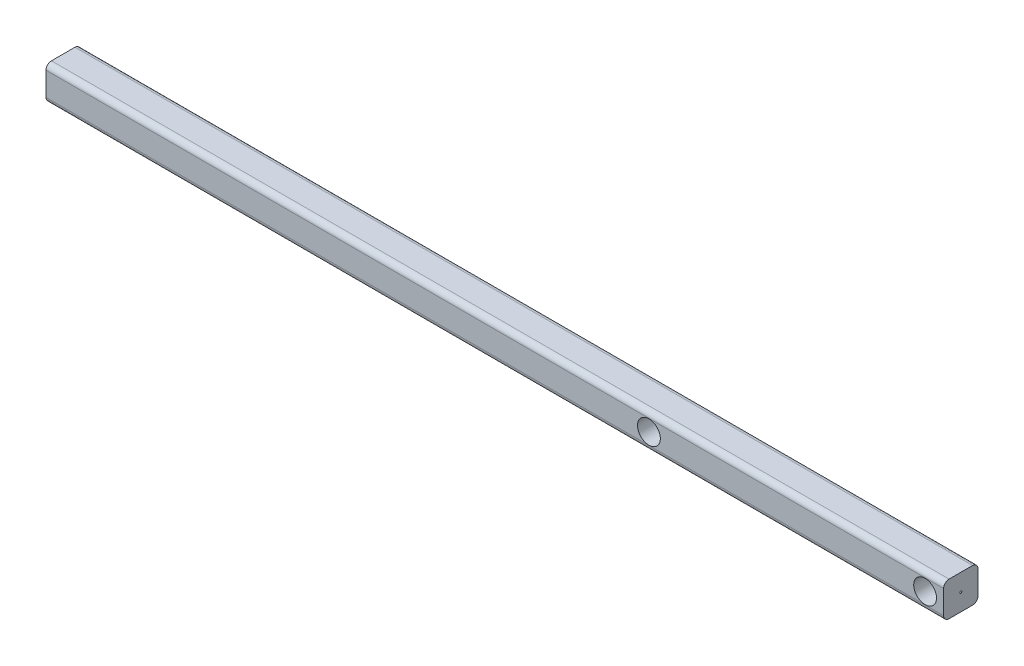
ISO-10303-21;
HEADER;
FILE_DESCRIPTION(('STEP AP214'),'2;1');
FILE_NAME('part.step','',(''),(''),'','','');
FILE_SCHEMA(('AUTOMOTIVE_DESIGN { 1 0 10303 214 1 1 1 1 }'));
ENDSEC;
DATA;
#1=APPLICATION_CONTEXT('core data for automotive mechanical design processes');
#2=APPLICATION_PROTOCOL_DEFINITION('international standard','automotive_design',2000,#1);
#3=PRODUCT_CONTEXT('',#1,'mechanical');
#4=PRODUCT('Part','Part','',(#3));
#5=PRODUCT_RELATED_PRODUCT_CATEGORY('part','',(#4));
#6=PRODUCT_DEFINITION_FORMATION('','',#4);
#7=PRODUCT_DEFINITION_CONTEXT('part definition',#1,'design');
#8=PRODUCT_DEFINITION('design','',#6,#7);
#9=PRODUCT_DEFINITION_SHAPE('','',#8);
#10=(LENGTH_UNIT() NAMED_UNIT(*) SI_UNIT(.MILLI.,.METRE.));
#11=(NAMED_UNIT(*) PLANE_ANGLE_UNIT() SI_UNIT($,.RADIAN.));
#12=(NAMED_UNIT(*) SI_UNIT($,.STERADIAN.) SOLID_ANGLE_UNIT());
#13=UNCERTAINTY_MEASURE_WITH_UNIT(LENGTH_MEASURE(1.E-05),#10,'distance_accuracy_value','');
#14=(GEOMETRIC_REPRESENTATION_CONTEXT(3) GLOBAL_UNCERTAINTY_ASSIGNED_CONTEXT((#13)) GLOBAL_UNIT_ASSIGNED_CONTEXT((#10,
#11,#12)) REPRESENTATION_CONTEXT('',''));
#15=CARTESIAN_POINT('',(0.,0.,0.));
#16=DIRECTION('',(0.,0.,1.));
#17=DIRECTION('',(1.,0.,0.));
#18=AXIS2_PLACEMENT_3D('',#15,#16,#17);
#19=CARTESIAN_POINT('',(165.1,0.,0.));
#20=DIRECTION('',(-1.,0.,0.));
#21=DIRECTION('',(0.,0.,1.));
#22=AXIS2_PLACEMENT_3D('',#19,#20,#21);
#23=CYLINDRICAL_SURFACE('',#22,0.186122299957088);
#24=CARTESIAN_POINT('',(163.791988099534,0.,0.186122299957089));
#25=CARTESIAN_POINT('',(163.792078316822,-0.010427907278757,0.186121846604635));
#26=CARTESIAN_POINT('',(163.792090307627,-0.0208635011874487,0.185242986726696));
#27=CARTESIAN_POINT('',(163.791963379452,-0.0414471761550977,0.181749413794973));
#28=CARTESIAN_POINT('',(163.791824292153,-0.0515949235815444,0.179132765900641));
#29=CARTESIAN_POINT('',(163.79141823497,-0.0713017636601238,0.172239467652708));
#30=CARTESIAN_POINT('',(163.791151336042,-0.0808611796119947,0.167963738606105));
#31=CARTESIAN_POINT('',(163.790526546924,-0.0991248984377559,0.157875261315146));
#32=CARTESIAN_POINT('',(163.790168675731,-0.10782937932225,0.152062833969416));
#33=CARTESIAN_POINT('',(163.789407370709,-0.124160448987272,0.139050137655764));
#34=CARTESIAN_POINT('',(163.789003836291,-0.131784571364698,0.131846779029851));
#35=CARTESIAN_POINT('',(163.788202677635,-0.145717596128625,0.116263255435251));
#36=CARTESIAN_POINT('',(163.787805053665,-0.152026438942248,0.10788303719189));
#37=CARTESIAN_POINT('',(163.787064350406,-0.163161103658044,0.0901645720709239));
#38=CARTESIAN_POINT('',(163.786721376432,-0.167984078466667,0.0808245311484106));
#39=CARTESIAN_POINT('',(163.786133315563,-0.175992628611122,0.0614641442734618));
#40=CARTESIAN_POINT('',(163.785888227153,-0.179178229305282,0.0514438088595989));
#41=CARTESIAN_POINT('',(163.785526535538,-0.183815481573218,0.0310280557570176));
#42=CARTESIAN_POINT('',(163.785409681062,-0.185270524591027,0.0206334129613672));
#43=CARTESIAN_POINT('',(163.785317966841,-0.186415751148911,-0.000253162914811269));
#44=CARTESIAN_POINT('',(163.78534310457,-0.186105966061032,-0.0107450942626025));
#45=CARTESIAN_POINT('',(163.785532046689,-0.183733491908787,-0.0315020133404447));
#46=CARTESIAN_POINT('',(163.785695519745,-0.181674991231673,-0.0417674832502983));
#47=CARTESIAN_POINT('',(163.786140687331,-0.175869991815682,-0.0618067764042813));
#48=CARTESIAN_POINT('',(163.786422383055,-0.172123476030103,-0.0715805946822767));
#49=CARTESIAN_POINT('',(163.787069903892,-0.16304398081363,-0.0903725411235635));
#50=CARTESIAN_POINT('',(163.787435829071,-0.157709112142676,-0.0993897528892511));
#51=CARTESIAN_POINT('',(163.788206586818,-0.145605550488633,-0.116402410078455));
#52=CARTESIAN_POINT('',(163.788611420125,-0.138836830237299,-0.124397836065542));
#53=CARTESIAN_POINT('',(163.789410811206,-0.124035027405267,-0.139163218445122));
#54=CARTESIAN_POINT('',(163.789805337206,-0.115998474491481,-0.145929698250767));
#55=CARTESIAN_POINT('',(163.790532656729,-0.0989011925875379,-0.158017953910922));
#56=CARTESIAN_POINT('',(163.790865450419,-0.089840466390876,-0.163339733705806));
#57=CARTESIAN_POINT('',(163.79142509431,-0.0709543634540301,-0.172384952423503));
#58=CARTESIAN_POINT('',(163.791651982615,-0.0611292632229046,-0.176108966184612));
#59=CARTESIAN_POINT('',(163.791967204661,-0.0409911059230146,-0.18185398213688));
#60=CARTESIAN_POINT('',(163.79205554158,-0.0306780600531185,-0.183875023393053));
#61=CARTESIAN_POINT('',(163.792076112842,-0.00989235228905667,-0.186152117398513));
#62=CARTESIAN_POINT('',(163.792008847146,0.000579691287245219,-0.186413812482342));
#63=CARTESIAN_POINT('',(163.791719202713,0.0214175057213008,-0.185180274511846));
#64=CARTESIAN_POINT('',(163.791496824998,0.0317832772798283,-0.183685053050422));
#65=CARTESIAN_POINT('',(163.79091466453,0.0521048604898493,-0.178983973191424));
#66=CARTESIAN_POINT('',(163.79055501092,0.0620610477358262,-0.175779721443092));
#67=CARTESIAN_POINT('',(163.789731252298,0.0812940434402515,-0.167753915919284));
#68=CARTESIAN_POINT('',(163.789267145034,0.0905708372393925,-0.162932327258965));
#69=CARTESIAN_POINT('',(163.788277888094,0.108214272106374,-0.151790604192473));
#70=CARTESIAN_POINT('',(163.787752547396,0.11657789835245,-0.145465712704639));
#71=CARTESIAN_POINT('',(163.786694773029,0.132126611557521,-0.131503796295649));
#72=CARTESIAN_POINT('',(163.786162339219,0.139311675042437,-0.123866745245695));
#73=CARTESIAN_POINT('',(163.785143496822,0.152319107628689,-0.107471815210021));
#74=CARTESIAN_POINT('',(163.784657217898,0.158137701711882,-0.0987109322716099));
#75=CARTESIAN_POINT('',(163.78378318587,0.16822063782102,-0.0803317341035736));
#76=CARTESIAN_POINT('',(163.78339543128,0.172485003280834,-0.0707134318044038));
#77=CARTESIAN_POINT('',(163.782760176302,0.179328955477798,-0.0509129677662558));
#78=CARTESIAN_POINT('',(163.782512385447,0.181912033091643,-0.0407320222738837));
#79=CARTESIAN_POINT('',(163.78218222554,0.185331938587018,-0.0200783997875875));
#80=CARTESIAN_POINT('',(163.782099852119,0.186168812596348,-0.00960573050725911));
#81=CARTESIAN_POINT('',(163.782109313745,0.18607198773557,0.0112881534619228));
#82=CARTESIAN_POINT('',(163.78220043491,0.185145544424771,0.0217094028680781));
#83=CARTESIAN_POINT('',(163.782545782771,0.181563547508014,0.0422474893258358));
#84=CARTESIAN_POINT('',(163.782800009586,0.178907992628697,0.0523643261532559));
#85=CARTESIAN_POINT('',(163.783444677571,0.171945106525453,0.0720066711867519));
#86=CARTESIAN_POINT('',(163.783835105529,0.167637935492626,0.0815322366364715));
#87=CARTESIAN_POINT('',(163.7847113479,0.15749499478265,0.0997261971420254));
#88=CARTESIAN_POINT('',(163.785197161425,0.151659239317405,0.108394600166233));
#89=CARTESIAN_POINT('',(163.786216068388,0.138597720270816,0.124665351970132));
#90=CARTESIAN_POINT('',(163.786749340644,0.131366568226484,0.132263363886256));
#91=CARTESIAN_POINT('',(163.78780704997,0.115730209279481,0.146141421831774));
#92=CARTESIAN_POINT('',(163.788331484839,0.107324714638328,0.152421143906024));
#93=CARTESIAN_POINT('',(163.789320063217,0.0895532700249857,0.163498311618437));
#94=CARTESIAN_POINT('',(163.789784036978,0.0801847426497464,0.168291633974797));
#95=CARTESIAN_POINT('',(163.790604020601,0.0607778511773022,0.176230629047925));
#96=CARTESIAN_POINT('',(163.79096015338,0.0507402657216815,0.179378180609724));
#97=CARTESIAN_POINT('',(163.791432072205,0.0338704108968983,0.183141364414061));
#98=CARTESIAN_POINT('',(163.791588351316,0.0271467435102715,0.184257666977998));
#99=CARTESIAN_POINT('',(163.791836906979,0.0136164766152724,0.185748281690757));
#100=CARTESIAN_POINT('',(163.791929183718,0.00680987735021416,0.186122596015974));
#101=CARTESIAN_POINT('',(163.791988099534,0.,0.186122299957089));
#102=B_SPLINE_CURVE_WITH_KNOTS('',3,(#24,#25,#26,#27,#28,#29,#30,#31,#32,#33,#34,#35,#36,#37,
#38,#39,#40,#41,#42,#43,#44,#45,#46,#47,#48,#49,#50,#51,#52,#53,#54,#55,#56,#57,#58,#59,#60,#61,
#62,#63,#64,#65,#66,#67,#68,#69,#70,#71,#72,#73,#74,#75,#76,#77,#78,#79,#80,#81,#82,#83,#84,#85,
#86,#87,#88,#89,#90,#91,#92,#93,#94,#95,#96,#97,#98,#99,#100,#101),.UNSPECIFIED.,.T.,.F.,(4,2,2,
2,2,2,2,2,2,2,2,2,2,2,2,2,2,2,2,2,2,2,2,2,2,2,2,2,2,2,2,2,2,2,2,2,2,2,4),(0.,0.0312600471332667,
0.0625549574560673,0.0938325141659515,0.125103544540697,0.156444852973824,0.187787580638714,
0.219189996312692,0.25059192563677,0.281932213389389,0.313271944030599,0.344536823140684,
0.375802017991442,0.407104550295471,0.438407677948296,0.469798025226804,0.501188286888261,
0.532567245589121,0.563945484458721,0.595223043124159,0.626500395407797,0.657748395730636,
0.688997070094665,0.720345976731277,0.751695507685387,0.783130652217978,0.8145653227678,
0.845934515177502,0.877302878926591,0.908542449578753,0.939782043236503,0.971018607716063,
1.00225488178622,1.03361428308806,1.06498138161828,1.09643472997495,1.1278520917223,
1.14826632304036,1.16868049447945),.UNSPECIFIED.);
#103=CARTESIAN_POINT('',(163.791988099534,0.,0.186122299957089));
#104=VERTEX_POINT('',#103);
#105=EDGE_CURVE('E41',#104,#104,#102,.T.);
#106=ORIENTED_EDGE('',*,*,#105,.F.);
#107=EDGE_LOOP('',(#106));
#108=FACE_BOUND('',#107,.T.);
#109=CARTESIAN_POINT('',(165.1,0.,0.));
#110=DIRECTION('',(1.,0.,0.));
#111=DIRECTION('',(0.,0.,-1.));
#112=AXIS2_PLACEMENT_3D('',#109,#110,#111);
#113=CIRCLE('',#112,0.186122299957088);
#114=CARTESIAN_POINT('',(165.1,0.,-0.186122299957088));
#115=VERTEX_POINT('',#114);
#116=EDGE_CURVE('E138',#115,#115,#113,.T.);
#117=ORIENTED_EDGE('',*,*,#116,.T.);
#118=EDGE_LOOP('',(#117));
#119=FACE_BOUND('',#118,.T.);
#120=ADVANCED_FACE('F37',(#108,#119),#23,.F.);
#121=CARTESIAN_POINT('',(165.1,0.,0.));
#122=DIRECTION('',(-1.,0.,0.));
#123=DIRECTION('',(0.,0.,1.));
#124=AXIS2_PLACEMENT_3D('',#121,#122,#123);
#125=PLANE('',#124);
#126=DIRECTION('',(0.,0.,-1.));
#127=VECTOR('',#126,1.);
#128=CARTESIAN_POINT('',(165.1,-3.16,3.16));
#129=LINE('',#128,#127);
#130=CARTESIAN_POINT('',(165.1,-3.16,2.16));
#131=VERTEX_POINT('',#130);
#132=CARTESIAN_POINT('',(165.1,-3.16,-2.16));
#133=VERTEX_POINT('',#132);
#134=EDGE_CURVE('E147',#131,#133,#129,.T.);
#135=ORIENTED_EDGE('',*,*,#134,.T.);
#136=CARTESIAN_POINT('',(165.1,-2.16,-2.16));
#137=DIRECTION('',(-1.,0.,0.));
#138=DIRECTION('',(0.,0.,1.));
#139=AXIS2_PLACEMENT_3D('',#136,#137,#138);
#140=CIRCLE('',#139,1.);
#141=CARTESIAN_POINT('',(165.1,-2.16,-3.16));
#142=VERTEX_POINT('',#141);
#143=EDGE_CURVE('E166',#133,#142,#140,.F.);
#144=ORIENTED_EDGE('',*,*,#143,.T.);
#145=DIRECTION('',(0.,1.,0.));
#146=VECTOR('',#145,1.);
#147=CARTESIAN_POINT('',(165.1,-3.16,-3.16));
#148=LINE('',#147,#146);
#149=CARTESIAN_POINT('',(165.1,2.16,-3.16));
#150=VERTEX_POINT('',#149);
#151=EDGE_CURVE('E130',#142,#150,#148,.T.);
#152=ORIENTED_EDGE('',*,*,#151,.T.);
#153=CARTESIAN_POINT('',(165.1,2.16,-2.16));
#154=DIRECTION('',(-1.,0.,0.));
#155=DIRECTION('',(0.,0.,1.));
#156=AXIS2_PLACEMENT_3D('',#153,#154,#155);
#157=CIRCLE('',#156,1.);
#158=CARTESIAN_POINT('',(165.1,3.16,-2.16));
#159=VERTEX_POINT('',#158);
#160=EDGE_CURVE('E161',#150,#159,#157,.F.);
#161=ORIENTED_EDGE('',*,*,#160,.T.);
#162=DIRECTION('',(0.,0.,1.));
#163=VECTOR('',#162,1.);
#164=CARTESIAN_POINT('',(165.1,3.16,3.16));
#165=LINE('',#164,#163);
#166=CARTESIAN_POINT('',(165.1,3.16,2.16));
#167=VERTEX_POINT('',#166);
#168=EDGE_CURVE('E224',#159,#167,#165,.T.);
#169=ORIENTED_EDGE('',*,*,#168,.T.);
#170=CARTESIAN_POINT('',(165.1,2.16,2.16));
#171=DIRECTION('',(-1.,0.,0.));
#172=DIRECTION('',(0.,0.,1.));
#173=AXIS2_PLACEMENT_3D('',#170,#171,#172);
#174=CIRCLE('',#173,1.);
#175=CARTESIAN_POINT('',(165.1,2.16,3.16));
#176=VERTEX_POINT('',#175);
#177=EDGE_CURVE('E66',#167,#176,#174,.F.);
#178=ORIENTED_EDGE('',*,*,#177,.T.);
#179=DIRECTION('',(0.,-1.,0.));
#180=VECTOR('',#179,1.);
#181=CARTESIAN_POINT('',(165.1,-3.16,3.16));
#182=LINE('',#181,#180);
#183=CARTESIAN_POINT('',(165.1,-2.16,3.16));
#184=VERTEX_POINT('',#183);
#185=EDGE_CURVE('E225',#176,#184,#182,.T.);
#186=ORIENTED_EDGE('',*,*,#185,.T.);
#187=CARTESIAN_POINT('',(165.1,-2.16,2.16));
#188=DIRECTION('',(-1.,0.,0.));
#189=DIRECTION('',(0.,0.,1.));
#190=AXIS2_PLACEMENT_3D('',#187,#188,#189);
#191=CIRCLE('',#190,1.);
#192=EDGE_CURVE('E164',#184,#131,#191,.F.);
#193=ORIENTED_EDGE('',*,*,#192,.T.);
#194=EDGE_LOOP('',(#135,#144,#152,#161,#169,#178,#186,#193));
#195=FACE_BOUND('',#194,.T.);
#196=ORIENTED_EDGE('',*,*,#116,.F.);
#197=EDGE_LOOP('',(#196));
#198=FACE_BOUND('',#197,.T.);
#199=ADVANCED_FACE('F229',(#195,#198),#125,.F.);
#200=CARTESIAN_POINT('',(0.,0.,0.));
#201=DIRECTION('',(-1.,0.,0.));
#202=DIRECTION('',(0.,0.,1.));
#203=AXIS2_PLACEMENT_3D('',#200,#201,#202);
#204=PLANE('',#203);
#205=DIRECTION('',(0.,1.,0.));
#206=VECTOR('',#205,1.);
#207=CARTESIAN_POINT('',(0.,-3.16,-3.16));
#208=LINE('',#207,#206);
#209=CARTESIAN_POINT('',(0.,-2.16,-3.16));
#210=VERTEX_POINT('',#209);
#211=CARTESIAN_POINT('',(0.,2.16,-3.16));
#212=VERTEX_POINT('',#211);
#213=EDGE_CURVE('E127',#210,#212,#208,.T.);
#214=ORIENTED_EDGE('',*,*,#213,.F.);
#215=CARTESIAN_POINT('',(0.,-2.16,-2.16));
#216=DIRECTION('',(-1.,0.,0.));
#217=DIRECTION('',(0.,0.,1.));
#218=AXIS2_PLACEMENT_3D('',#215,#216,#217);
#219=CIRCLE('',#218,1.);
#220=CARTESIAN_POINT('',(0.,-3.16,-2.16));
#221=VERTEX_POINT('',#220);
#222=EDGE_CURVE('E110',#210,#221,#219,.T.);
#223=ORIENTED_EDGE('',*,*,#222,.T.);
#224=DIRECTION('',(0.,0.,-1.));
#225=VECTOR('',#224,1.);
#226=CARTESIAN_POINT('',(0.,-3.16,3.16));
#227=LINE('',#226,#225);
#228=CARTESIAN_POINT('',(0.,-3.16,2.16));
#229=VERTEX_POINT('',#228);
#230=EDGE_CURVE('E151',#229,#221,#227,.T.);
#231=ORIENTED_EDGE('',*,*,#230,.F.);
#232=CARTESIAN_POINT('',(0.,-2.16,2.16));
#233=DIRECTION('',(-1.,0.,0.));
#234=DIRECTION('',(0.,0.,1.));
#235=AXIS2_PLACEMENT_3D('',#232,#233,#234);
#236=CIRCLE('',#235,1.);
#237=CARTESIAN_POINT('',(0.,-2.16,3.16));
#238=VERTEX_POINT('',#237);
#239=EDGE_CURVE('E121',#229,#238,#236,.T.);
#240=ORIENTED_EDGE('',*,*,#239,.T.);
#241=DIRECTION('',(0.,-1.,0.));
#242=VECTOR('',#241,1.);
#243=CARTESIAN_POINT('',(0.,-3.16,3.16));
#244=LINE('',#243,#242);
#245=CARTESIAN_POINT('',(0.,2.16,3.16));
#246=VERTEX_POINT('',#245);
#247=EDGE_CURVE('E141',#246,#238,#244,.T.);
#248=ORIENTED_EDGE('',*,*,#247,.F.);
#249=CARTESIAN_POINT('',(0.,2.16,2.16));
#250=DIRECTION('',(-1.,0.,0.));
#251=DIRECTION('',(0.,0.,1.));
#252=AXIS2_PLACEMENT_3D('',#249,#250,#251);
#253=CIRCLE('',#252,1.);
#254=CARTESIAN_POINT('',(0.,3.16,2.16));
#255=VERTEX_POINT('',#254);
#256=EDGE_CURVE('E155',#246,#255,#253,.T.);
#257=ORIENTED_EDGE('',*,*,#256,.T.);
#258=DIRECTION('',(0.,0.,1.));
#259=VECTOR('',#258,1.);
#260=CARTESIAN_POINT('',(0.,3.16,3.16));
#261=LINE('',#260,#259);
#262=CARTESIAN_POINT('',(0.,3.16,-2.16));
#263=VERTEX_POINT('',#262);
#264=EDGE_CURVE('E137',#263,#255,#261,.T.);
#265=ORIENTED_EDGE('',*,*,#264,.F.);
#266=CARTESIAN_POINT('',(0.,2.16,-2.16));
#267=DIRECTION('',(-1.,0.,0.));
#268=DIRECTION('',(0.,0.,1.));
#269=AXIS2_PLACEMENT_3D('',#266,#267,#268);
#270=CIRCLE('',#269,1.);
#271=EDGE_CURVE('E131',#263,#212,#270,.T.);
#272=ORIENTED_EDGE('',*,*,#271,.T.);
#273=EDGE_LOOP('',(#214,#223,#231,#240,#248,#257,#265,#272));
#274=FACE_BOUND('',#273,.T.);
#275=CARTESIAN_POINT('',(0.,0.,0.));
#276=DIRECTION('',(1.,0.,0.));
#277=DIRECTION('',(0.,0.,-1.));
#278=AXIS2_PLACEMENT_3D('',#275,#276,#277);
#279=CIRCLE('',#278,0.186122299957088);
#280=CARTESIAN_POINT('',(0.,0.,-0.186122299957088));
#281=VERTEX_POINT('',#280);
#282=EDGE_CURVE('E144',#281,#281,#279,.T.);
#283=ORIENTED_EDGE('',*,*,#282,.T.);
#284=EDGE_LOOP('',(#283));
#285=FACE_BOUND('',#284,.T.);
#286=ADVANCED_FACE('F134',(#274,#285),#204,.T.);
#287=CARTESIAN_POINT('',(165.1,-3.16,-3.16));
#288=DIRECTION('',(0.,0.,1.));
#289=DIRECTION('',(1.,0.,0.));
#290=AXIS2_PLACEMENT_3D('',#287,#288,#289);
#291=PLANE('',#290);
#292=CARTESIAN_POINT('',(161.692066873245,-0.0181891005987243,-3.16));
#293=DIRECTION('',(0.,0.,-1.));
#294=DIRECTION('',(-1.,0.,0.));
#295=AXIS2_PLACEMENT_3D('',#292,#293,#294);
#296=CIRCLE('',#295,2.09999999999999);
#297=CARTESIAN_POINT('',(159.592066873245,-0.0181891005987243,-3.16));
#298=VERTEX_POINT('',#297);
#299=EDGE_CURVE('E182',#298,#298,#296,.T.);
#300=ORIENTED_EDGE('',*,*,#299,.F.);
#301=EDGE_LOOP('',(#300));
#302=FACE_BOUND('',#301,.T.);
#303=CARTESIAN_POINT('',(110.892066873245,-0.0181891005987243,-3.16));
#304=DIRECTION('',(0.,0.,-1.));
#305=DIRECTION('',(-1.,0.,0.));
#306=AXIS2_PLACEMENT_3D('',#303,#304,#305);
#307=CIRCLE('',#306,2.09999999999999);
#308=CARTESIAN_POINT('',(108.792066873245,-0.0181891005987243,-3.16));
#309=VERTEX_POINT('',#308);
#310=EDGE_CURVE('E217',#309,#309,#307,.T.);
#311=ORIENTED_EDGE('',*,*,#310,.F.);
#312=EDGE_LOOP('',(#311));
#313=FACE_BOUND('',#312,.T.);
#314=ORIENTED_EDGE('',*,*,#151,.F.);
#315=DIRECTION('',(-1.,0.,0.));
#316=VECTOR('',#315,1.);
#317=CARTESIAN_POINT('',(165.1,-2.16,-3.16));
#318=LINE('',#317,#316);
#319=EDGE_CURVE('E114',#142,#210,#318,.T.);
#320=ORIENTED_EDGE('',*,*,#319,.T.);
#321=ORIENTED_EDGE('',*,*,#213,.T.);
#322=DIRECTION('',(-1.,0.,0.));
#323=VECTOR('',#322,1.);
#324=CARTESIAN_POINT('',(165.1,2.16,-3.16));
#325=LINE('',#324,#323);
#326=EDGE_CURVE('E132',#212,#150,#325,.F.);
#327=ORIENTED_EDGE('',*,*,#326,.T.);
#328=EDGE_LOOP('',(#314,#320,#321,#327));
#329=FACE_BOUND('',#328,.T.);
#330=ADVANCED_FACE('F126',(#302,#313,#329),#291,.F.);
#331=CARTESIAN_POINT('',(165.1,3.16,3.16));
#332=DIRECTION('',(0.,-1.,0.));
#333=DIRECTION('',(0.,0.,-1.));
#334=AXIS2_PLACEMENT_3D('',#331,#332,#333);
#335=PLANE('',#334);
#336=ORIENTED_EDGE('',*,*,#264,.T.);
#337=DIRECTION('',(-1.,0.,0.));
#338=VECTOR('',#337,1.);
#339=CARTESIAN_POINT('',(165.1,3.16,2.16));
#340=LINE('',#339,#338);
#341=EDGE_CURVE('E11',#255,#167,#340,.F.);
#342=ORIENTED_EDGE('',*,*,#341,.T.);
#343=ORIENTED_EDGE('',*,*,#168,.F.);
#344=DIRECTION('',(-1.,0.,0.));
#345=VECTOR('',#344,1.);
#346=CARTESIAN_POINT('',(165.1,3.16,-2.16));
#347=LINE('',#346,#345);
#348=EDGE_CURVE('E51',#159,#263,#347,.T.);
#349=ORIENTED_EDGE('',*,*,#348,.T.);
#350=EDGE_LOOP('',(#336,#342,#343,#349));
#351=FACE_BOUND('',#350,.T.);
#352=ADVANCED_FACE('F243',(#351),#335,.F.);
#353=CARTESIAN_POINT('',(165.1,-3.16,3.16));
#354=DIRECTION('',(0.,0.,-1.));
#355=DIRECTION('',(-1.,0.,0.));
#356=AXIS2_PLACEMENT_3D('',#353,#354,#355);
#357=PLANE('',#356);
#358=CARTESIAN_POINT('',(161.692066873245,-0.0181891005987243,3.16));
#359=DIRECTION('',(0.,0.,-1.));
#360=DIRECTION('',(-1.,0.,0.));
#361=AXIS2_PLACEMENT_3D('',#358,#359,#360);
#362=CIRCLE('',#361,2.09999999999999);
#363=CARTESIAN_POINT('',(159.592066873245,-0.0181891005987243,3.16));
#364=VERTEX_POINT('',#363);
#365=EDGE_CURVE('E209',#364,#364,#362,.T.);
#366=ORIENTED_EDGE('',*,*,#365,.T.);
#367=EDGE_LOOP('',(#366));
#368=FACE_BOUND('',#367,.T.);
#369=CARTESIAN_POINT('',(110.892066873245,-0.0181891005987243,3.16));
#370=DIRECTION('',(0.,0.,-1.));
#371=DIRECTION('',(-1.,0.,0.));
#372=AXIS2_PLACEMENT_3D('',#369,#370,#371);
#373=CIRCLE('',#372,2.09999999999999);
#374=CARTESIAN_POINT('',(108.792066873245,-0.0181891005987243,3.16));
#375=VERTEX_POINT('',#374);
#376=EDGE_CURVE('E205',#375,#375,#373,.T.);
#377=ORIENTED_EDGE('',*,*,#376,.T.);
#378=EDGE_LOOP('',(#377));
#379=FACE_BOUND('',#378,.T.);
#380=ORIENTED_EDGE('',*,*,#247,.T.);
#381=DIRECTION('',(-1.,0.,0.));
#382=VECTOR('',#381,1.);
#383=CARTESIAN_POINT('',(165.1,-2.16,3.16));
#384=LINE('',#383,#382);
#385=EDGE_CURVE('E59',#238,#184,#384,.F.);
#386=ORIENTED_EDGE('',*,*,#385,.T.);
#387=ORIENTED_EDGE('',*,*,#185,.F.);
#388=DIRECTION('',(-1.,0.,0.));
#389=VECTOR('',#388,1.);
#390=CARTESIAN_POINT('',(165.1,2.16,3.16));
#391=LINE('',#390,#389);
#392=EDGE_CURVE('E168',#176,#246,#391,.T.);
#393=ORIENTED_EDGE('',*,*,#392,.T.);
#394=EDGE_LOOP('',(#380,#386,#387,#393));
#395=FACE_BOUND('',#394,.T.);
#396=ADVANCED_FACE('F237',(#368,#379,#395),#357,.F.);
#397=CARTESIAN_POINT('',(165.1,-3.16,3.16));
#398=DIRECTION('',(0.,1.,0.));
#399=DIRECTION('',(0.,0.,1.));
#400=AXIS2_PLACEMENT_3D('',#397,#398,#399);
#401=PLANE('',#400);
#402=ORIENTED_EDGE('',*,*,#230,.T.);
#403=DIRECTION('',(-1.,0.,0.));
#404=VECTOR('',#403,1.);
#405=CARTESIAN_POINT('',(165.1,-3.16,-2.16));
#406=LINE('',#405,#404);
#407=EDGE_CURVE('E115',#221,#133,#406,.F.);
#408=ORIENTED_EDGE('',*,*,#407,.T.);
#409=ORIENTED_EDGE('',*,*,#134,.F.);
#410=DIRECTION('',(-1.,0.,0.));
#411=VECTOR('',#410,1.);
#412=CARTESIAN_POINT('',(165.1,-3.16,2.16));
#413=LINE('',#412,#411);
#414=EDGE_CURVE('E120',#131,#229,#413,.T.);
#415=ORIENTED_EDGE('',*,*,#414,.T.);
#416=EDGE_LOOP('',(#402,#408,#409,#415));
#417=FACE_BOUND('',#416,.T.);
#418=ADVANCED_FACE('F233',(#417),#401,.F.);
#419=CARTESIAN_POINT('',(108.792145646956,0.,0.186122299957089));
#420=CARTESIAN_POINT('',(108.792236165869,0.010437889701856,0.186121844257441));
#421=CARTESIAN_POINT('',(108.792405183893,0.0208821738784626,0.185241293977184));
#422=CARTESIAN_POINT('',(108.7928894019,0.0414802107503931,0.181742323572651));
#423=CARTESIAN_POINT('',(108.793204767328,0.0516336207827093,0.179121935110181));
#424=CARTESIAN_POINT('',(108.793953374306,0.0713486883580442,0.172220339452475));
#425=CARTESIAN_POINT('',(108.794386545327,0.0809106957760162,0.167940125324291));
#426=CARTESIAN_POINT('',(108.79532922708,0.0991778640645701,0.157842244941071));
#427=CARTESIAN_POINT('',(108.79583872176,0.107883204475823,0.152024901784103));
#428=CARTESIAN_POINT('',(108.796885004696,0.124219590173705,0.138998010882917));
#429=CARTESIAN_POINT('',(108.79742186543,0.131847556897266,0.131784607805289));
#430=CARTESIAN_POINT('',(108.798466823829,0.145785930713842,0.116178471548368));
#431=CARTESIAN_POINT('',(108.798974920239,0.152096280380489,0.107785686994158));
#432=CARTESIAN_POINT('',(108.799910258745,0.163227705726657,0.0900446093024885));
#433=CARTESIAN_POINT('',(108.8003373921,0.168046783919542,0.0806950567211975));
#434=CARTESIAN_POINT('',(108.80106490332,0.176045261230212,0.0613144733471929));
#435=CARTESIAN_POINT('',(108.801365284286,0.179224700477291,0.0512834592396901));
#436=CARTESIAN_POINT('',(108.801806520071,0.183843262539249,0.0308609116182943));
#437=CARTESIAN_POINT('',(108.801947913297,0.185288260122488,0.0204707184437703));
#438=CARTESIAN_POINT('',(108.802057917795,0.186415161792608,-0.000405616846314139));
#439=CARTESIAN_POINT('',(108.802026533295,0.18609710902417,-0.0108917566076378));
#440=CARTESIAN_POINT('',(108.801794740121,0.183711380499417,-0.0316255859256081));
#441=CARTESIAN_POINT('',(108.801594893741,0.181649525153479,-0.0418739523403421));
#442=CARTESIAN_POINT('',(108.801048064426,0.175843810228726,-0.0618784323197827));
#443=CARTESIAN_POINT('',(108.80070107977,0.172099930967012,-0.0716345401226354));
#444=CARTESIAN_POINT('',(108.799895691831,0.163030117340232,-0.0903959915270514));
#445=CARTESIAN_POINT('',(108.799437106551,0.157701595571824,-0.0994000761879287));
#446=CARTESIAN_POINT('',(108.798456454787,0.145615820369686,-0.11638821671088));
#447=CARTESIAN_POINT('',(108.797934386583,0.138858528213557,-0.124372244918072));
#448=CARTESIAN_POINT('',(108.796878012245,0.124073554216898,-0.139128730541697));
#449=CARTESIAN_POINT('',(108.796343664027,0.116040672290095,-0.145895975747462));
#450=CARTESIAN_POINT('',(108.795319055235,0.0989507466047946,-0.15798678448555));
#451=CARTESIAN_POINT('',(108.794828794869,0.0898936980268459,-0.163310341223863));
#452=CARTESIAN_POINT('',(108.793940569101,0.0710037905465831,-0.17236515740739));
#453=CARTESIAN_POINT('',(108.793542666933,0.0611704062656391,-0.176095327405952));
#454=CARTESIAN_POINT('',(108.792877314272,0.0410123710083407,-0.181849811119691));
#455=CARTESIAN_POINT('',(108.792609860694,0.0306877316582143,-0.183874165184158));
#456=CARTESIAN_POINT('',(108.792228764052,0.00987873544195974,-0.186153408445671));
#457=CARTESIAN_POINT('',(108.792114586631,-0.000604937008753058,-0.186414457853213));
#458=CARTESIAN_POINT('',(108.79204352161,-0.0214680861899529,-0.185175132706346));
#459=CARTESIAN_POINT('',(108.792086631743,-0.0318475644197559,-0.183674783534552));
#460=CARTESIAN_POINT('',(108.792317453158,-0.0521832317439134,-0.178961215789191));
#461=CARTESIAN_POINT('',(108.792504835495,-0.0621403294634929,-0.175751898844721));
#462=CARTESIAN_POINT('',(108.792995611198,-0.0813752315194363,-0.167714731151745));
#463=CARTESIAN_POINT('',(108.793299006184,-0.0906530263712433,-0.162886857809894));
#464=CARTESIAN_POINT('',(108.79398191923,-0.108287160047642,-0.151738069461346));
#465=CARTESIAN_POINT('',(108.794361593392,-0.11664155393302,-0.14541408796647));
#466=CARTESIAN_POINT('',(108.795148096385,-0.132172573873516,-0.131456950550184));
#467=CARTESIAN_POINT('',(108.795554925735,-0.139349177403594,-0.123823769596263));
#468=CARTESIAN_POINT('',(108.796346062521,-0.152341580956164,-0.107439164116747));
#469=CARTESIAN_POINT('',(108.796730302787,-0.158153462526887,-0.0986846285006575));
#470=CARTESIAN_POINT('',(108.797427325208,-0.168224956870835,-0.0803214314994157));
#471=CARTESIAN_POINT('',(108.797740107904,-0.172484581392607,-0.0707127765795083));
#472=CARTESIAN_POINT('',(108.798255385965,-0.179326618718904,-0.0509216006205995));
#473=CARTESIAN_POINT('',(108.798457970428,-0.181910386830977,-0.0407395505624046));
#474=CARTESIAN_POINT('',(108.79872828052,-0.185331335723129,-0.0200844527661894));
#475=CARTESIAN_POINT('',(108.798796008569,-0.186168547847558,-0.00961141025384754));
#476=CARTESIAN_POINT('',(108.798788284821,-0.186072239496471,0.011296427042157));
#477=CARTESIAN_POINT('',(108.798713241523,-0.185143771029434,0.0217312456156276));
#478=CARTESIAN_POINT('',(108.798429981627,-0.181553000062445,0.0422962503221566));
#479=CARTESIAN_POINT('',(108.798221764756,-0.178890694028351,0.0524264358342266));
#480=CARTESIAN_POINT('',(108.797697675739,-0.171909082559467,0.0720948832689571));
#481=CARTESIAN_POINT('',(108.797381810335,-0.16758988087596,0.0816331822108578));
#482=CARTESIAN_POINT('',(108.796681152113,-0.157417537288518,0.0998502062942657));
#483=CARTESIAN_POINT('',(108.796296360391,-0.151564419749018,0.10852894508585));
#484=CARTESIAN_POINT('',(108.795504158667,-0.138471246985164,0.124806339475656));
#485=CARTESIAN_POINT('',(108.795096689744,-0.131227446355409,0.132401979528085));
#486=CARTESIAN_POINT('',(108.79431110468,-0.115565077064156,0.146272548457025));
#487=CARTESIAN_POINT('',(108.793932995528,-0.107146230022046,0.152547163482891));
#488=CARTESIAN_POINT('',(108.793254382436,-0.0893606060813994,0.163603284688622));
#489=CARTESIAN_POINT('',(108.792953990295,-0.0799924902744073,0.168382641935926));
#490=CARTESIAN_POINT('',(108.792472651689,-0.060590564369522,0.176294667045177));
#491=CARTESIAN_POINT('',(108.792291568399,-0.0505575314008554,0.179429220354779));
#492=CARTESIAN_POINT('',(108.792113827943,-0.0337214293131982,0.183167782421973));
#493=CARTESIAN_POINT('',(108.792074666342,-0.0270261236387088,0.184274291780998));
#494=CARTESIAN_POINT('',(108.79206118285,-0.0135547774629194,0.18575169734821));
#495=CARTESIAN_POINT('',(108.792086860751,-0.0067787372194155,0.186122595904665));
#496=CARTESIAN_POINT('',(108.792145646956,0.,0.186122299957089));
#497=B_SPLINE_CURVE_WITH_KNOTS('',3,(#419,#420,#421,#422,#423,#424,#425,#426,#427,#428,#429,
#430,#431,#432,#433,#434,#435,#436,#437,#438,#439,#440,#441,#442,#443,#444,#445,#446,#447,#448,
#449,#450,#451,#452,#453,#454,#455,#456,#457,#458,#459,#460,#461,#462,#463,#464,#465,#466,#467,
#468,#469,#470,#471,#472,#473,#474,#475,#476,#477,#478,#479,#480,#481,#482,#483,#484,#485,#486,
#487,#488,#489,#490,#491,#492,#493,#494,#495,#496),.UNSPECIFIED.,.T.,.F.,(4,2,2,2,2,2,2,2,2,2,2,
2,2,2,2,2,2,2,2,2,2,2,2,2,2,2,2,2,2,2,2,2,2,2,2,2,2,2,4),(0.,0.031290075833718,
0.0626156116514125,0.0939224343704268,0.125222681754349,0.156610633566484,0.187999953090111,
0.219431136910742,0.250861551433281,0.28218520409905,0.31350809022801,0.34472683853088,
0.37594595216237,0.407216322864513,0.438487541161912,0.469889677276436,0.501291961167101,
0.532715681514116,0.564138658545054,0.595451800486274,0.626764491195327,0.658005998592651,
0.689247942106737,0.720554483886229,0.751861624328298,0.783257585156762,0.814653308354136,
0.846023609271118,0.877393347200011,0.908673464289783,0.939953645139124,0.971231867609698,
1.00250959329291,1.03387276922142,1.06524338806172,1.09665888673319,1.1280382945422,
1.14835924875975,1.1686801381072),.UNSPECIFIED.);
#498=CARTESIAN_POINT('',(108.792145646956,0.,0.186122299957089));
#499=VERTEX_POINT('',#498);
#500=EDGE_CURVE('E174',#499,#499,#497,.T.);
#501=ORIENTED_EDGE('',*,*,#500,.F.);
#502=EDGE_LOOP('',(#501));
#503=FACE_BOUND('',#502,.T.);
#504=ORIENTED_EDGE('',*,*,#282,.F.);
#505=EDGE_LOOP('',(#504));
#506=FACE_BOUND('',#505,.T.);
#507=ADVANCED_FACE('F186',(#503,#506),#23,.F.);
#508=CARTESIAN_POINT('',(165.1,-2.16,-2.16));
#509=DIRECTION('',(-1.,0.,0.));
#510=DIRECTION('',(0.,0.,1.));
#511=AXIS2_PLACEMENT_3D('',#508,#509,#510);
#512=CYLINDRICAL_SURFACE('',#511,1.);
#513=ORIENTED_EDGE('',*,*,#143,.F.);
#514=ORIENTED_EDGE('',*,*,#407,.F.);
#515=ORIENTED_EDGE('',*,*,#222,.F.);
#516=ORIENTED_EDGE('',*,*,#319,.F.);
#517=EDGE_LOOP('',(#513,#514,#515,#516));
#518=FACE_BOUND('',#517,.T.);
#519=ADVANCED_FACE('F113',(#518),#512,.T.);
#520=CARTESIAN_POINT('',(165.1,-2.16,2.16));
#521=DIRECTION('',(-1.,0.,0.));
#522=DIRECTION('',(0.,0.,1.));
#523=AXIS2_PLACEMENT_3D('',#520,#521,#522);
#524=CYLINDRICAL_SURFACE('',#523,1.);
#525=ORIENTED_EDGE('',*,*,#192,.F.);
#526=ORIENTED_EDGE('',*,*,#385,.F.);
#527=ORIENTED_EDGE('',*,*,#239,.F.);
#528=ORIENTED_EDGE('',*,*,#414,.F.);
#529=EDGE_LOOP('',(#525,#526,#527,#528));
#530=FACE_BOUND('',#529,.T.);
#531=ADVANCED_FACE('F235',(#530),#524,.T.);
#532=CARTESIAN_POINT('',(165.1,2.16,2.16));
#533=DIRECTION('',(-1.,0.,0.));
#534=DIRECTION('',(0.,0.,1.));
#535=AXIS2_PLACEMENT_3D('',#532,#533,#534);
#536=CYLINDRICAL_SURFACE('',#535,1.);
#537=ORIENTED_EDGE('',*,*,#177,.F.);
#538=ORIENTED_EDGE('',*,*,#341,.F.);
#539=ORIENTED_EDGE('',*,*,#256,.F.);
#540=ORIENTED_EDGE('',*,*,#392,.F.);
#541=EDGE_LOOP('',(#537,#538,#539,#540));
#542=FACE_BOUND('',#541,.T.);
#543=ADVANCED_FACE('F240',(#542),#536,.T.);
#544=CARTESIAN_POINT('',(165.1,2.16,-2.16));
#545=DIRECTION('',(-1.,0.,0.));
#546=DIRECTION('',(0.,0.,1.));
#547=AXIS2_PLACEMENT_3D('',#544,#545,#546);
#548=CYLINDRICAL_SURFACE('',#547,1.);
#549=ORIENTED_EDGE('',*,*,#160,.F.);
#550=ORIENTED_EDGE('',*,*,#326,.F.);
#551=ORIENTED_EDGE('',*,*,#271,.F.);
#552=ORIENTED_EDGE('',*,*,#348,.F.);
#553=EDGE_LOOP('',(#549,#550,#551,#552));
#554=FACE_BOUND('',#553,.T.);
#555=ADVANCED_FACE('F39',(#554),#548,.T.);
#556=CARTESIAN_POINT('',(110.892066873245,-0.0181891005987243,161.94));
#557=DIRECTION('',(0.,0.,-1.));
#558=DIRECTION('',(-1.,0.,0.));
#559=AXIS2_PLACEMENT_3D('',#556,#557,#558);
#560=CYLINDRICAL_SURFACE('',#559,2.09999999999999);
#561=ORIENTED_EDGE('',*,*,#310,.T.);
#562=EDGE_LOOP('',(#561));
#563=FACE_BOUND('',#562,.T.);
#564=ORIENTED_EDGE('',*,*,#500,.T.);
#565=EDGE_LOOP('',(#564));
#566=FACE_BOUND('',#565,.T.);
#567=CARTESIAN_POINT('',(112.991988099534,0.,0.186122299957089));
#568=CARTESIAN_POINT('',(112.992078316822,-0.0104279072787572,0.186121846604636));
#569=CARTESIAN_POINT('',(112.992090307627,-0.020863501187449,0.185242986726696));
#570=CARTESIAN_POINT('',(112.991963379452,-0.041447176155098,0.181749413794973));
#571=CARTESIAN_POINT('',(112.991824292153,-0.0515949235815445,0.179132765900641));
#572=CARTESIAN_POINT('',(112.99141823497,-0.0713017636601239,0.172239467652708));
#573=CARTESIAN_POINT('',(112.991151336042,-0.0808611796119948,0.167963738606105));
#574=CARTESIAN_POINT('',(112.990526546924,-0.0991248984377562,0.157875261315145));
#575=CARTESIAN_POINT('',(112.990168675731,-0.10782937932225,0.152062833969416));
#576=CARTESIAN_POINT('',(112.989407370709,-0.124160448987272,0.139050137655763));
#577=CARTESIAN_POINT('',(112.989003836291,-0.131784571364698,0.131846779029851));
#578=CARTESIAN_POINT('',(112.988202677635,-0.145717596128625,0.116263255435251));
#579=CARTESIAN_POINT('',(112.987805053665,-0.152026438942248,0.107883037191889));
#580=CARTESIAN_POINT('',(112.987064350406,-0.163161103658045,0.0901645720709228));
#581=CARTESIAN_POINT('',(112.986721376432,-0.167984078466667,0.0808245311484094));
#582=CARTESIAN_POINT('',(112.986133315563,-0.175992628611122,0.0614641442734609));
#583=CARTESIAN_POINT('',(112.985888227153,-0.179178229305282,0.0514438088595982));
#584=CARTESIAN_POINT('',(112.985526535538,-0.183815481573218,0.0310280557570171));
#585=CARTESIAN_POINT('',(112.985409681062,-0.185270524591027,0.0206334129613665));
#586=CARTESIAN_POINT('',(112.985317966841,-0.186415751148911,-0.000253162914812025));
#587=CARTESIAN_POINT('',(112.98534310457,-0.186105966061032,-0.0107450942626032));
#588=CARTESIAN_POINT('',(112.985532046689,-0.183733491908787,-0.0315020133404456));
#589=CARTESIAN_POINT('',(112.985695519745,-0.181674991231673,-0.0417674832502994));
#590=CARTESIAN_POINT('',(112.986140687331,-0.175869991815682,-0.0618067764042824));
#591=CARTESIAN_POINT('',(112.986422383055,-0.172123476030102,-0.0715805946822776));
#592=CARTESIAN_POINT('',(112.987069903892,-0.16304398081363,-0.0903725411235642));
#593=CARTESIAN_POINT('',(112.987435829071,-0.157709112142675,-0.0993897528892518));
#594=CARTESIAN_POINT('',(112.988206586818,-0.145605550488633,-0.116402410078456));
#595=CARTESIAN_POINT('',(112.988611420125,-0.138836830237298,-0.124397836065542));
#596=CARTESIAN_POINT('',(112.989410811206,-0.124035027405267,-0.139163218445122));
#597=CARTESIAN_POINT('',(112.989805337206,-0.115998474491481,-0.145929698250768));
#598=CARTESIAN_POINT('',(112.990532656729,-0.098901192587537,-0.158017953910923));
#599=CARTESIAN_POINT('',(112.990865450419,-0.0898404663908751,-0.163339733705806));
#600=CARTESIAN_POINT('',(112.99142509431,-0.0709543634540292,-0.172384952423504));
#601=CARTESIAN_POINT('',(112.991651982615,-0.0611292632229037,-0.176108966184613));
#602=CARTESIAN_POINT('',(112.991967204661,-0.0409911059230139,-0.18185398213688));
#603=CARTESIAN_POINT('',(112.99205554158,-0.0306780600531179,-0.183875023393053));
#604=CARTESIAN_POINT('',(112.992076112842,-0.009892352289056,-0.186152117398513));
#605=CARTESIAN_POINT('',(112.992008847146,0.000579691287245975,-0.186413812482342));
#606=CARTESIAN_POINT('',(112.991719202713,0.0214175057213016,-0.185180274511846));
#607=CARTESIAN_POINT('',(112.991496824998,0.0317832772798291,-0.183685053050421));
#608=CARTESIAN_POINT('',(112.99091466453,0.0521048604898505,-0.178983973191424));
#609=CARTESIAN_POINT('',(112.99055501092,0.0620610477358277,-0.175779721443092));
#610=CARTESIAN_POINT('',(112.989731252298,0.0812940434402536,-0.167753915919283));
#611=CARTESIAN_POINT('',(112.989267145034,0.0905708372393947,-0.162932327258964));
#612=CARTESIAN_POINT('',(112.988277888094,0.108214272106376,-0.151790604192472));
#613=CARTESIAN_POINT('',(112.987752547396,0.116577898352451,-0.145465712704639));
#614=CARTESIAN_POINT('',(112.986694773029,0.132126611557521,-0.131503796295649));
#615=CARTESIAN_POINT('',(112.986162339219,0.139311675042437,-0.123866745245695));
#616=CARTESIAN_POINT('',(112.985143496822,0.152319107628689,-0.10747181521002));
#617=CARTESIAN_POINT('',(112.984657217898,0.158137701711883,-0.0987109322716094));
#618=CARTESIAN_POINT('',(112.98378318587,0.16822063782102,-0.0803317341035727));
#619=CARTESIAN_POINT('',(112.98339543128,0.172485003280834,-0.0707134318044026));
#620=CARTESIAN_POINT('',(112.982760176302,0.179328955477799,-0.0509129677662544));
#621=CARTESIAN_POINT('',(112.982512385447,0.181912033091644,-0.0407320222738822));
#622=CARTESIAN_POINT('',(112.98218222554,0.185331938587019,-0.0200783997875861));
#623=CARTESIAN_POINT('',(112.982099852119,0.186168812596348,-0.0096057305072579));
#624=CARTESIAN_POINT('',(112.982109313745,0.18607198773557,0.0112881534619239));
#625=CARTESIAN_POINT('',(112.98220043491,0.185145544424771,0.0217094028680791));
#626=CARTESIAN_POINT('',(112.982545782771,0.181563547508014,0.0422474893258368));
#627=CARTESIAN_POINT('',(112.982800009586,0.178907992628697,0.0523643261532569));
#628=CARTESIAN_POINT('',(112.983444677571,0.171945106525452,0.0720066711867526));
#629=CARTESIAN_POINT('',(112.983835105529,0.167637935492626,0.0815322366364721));
#630=CARTESIAN_POINT('',(112.9847113479,0.15749499478265,0.099726197142026));
#631=CARTESIAN_POINT('',(112.985197161425,0.151659239317404,0.108394600166234));
#632=CARTESIAN_POINT('',(112.986216068388,0.138597720270816,0.124665351970132));
#633=CARTESIAN_POINT('',(112.986749340644,0.131366568226484,0.132263363886256));
#634=CARTESIAN_POINT('',(112.98780704997,0.115730209279482,0.146141421831773));
#635=CARTESIAN_POINT('',(112.988331484839,0.107324714638328,0.152421143906024));
#636=CARTESIAN_POINT('',(112.989320063217,0.0895532700249854,0.163498311618437));
#637=CARTESIAN_POINT('',(112.989784036978,0.080184742649746,0.168291633974797));
#638=CARTESIAN_POINT('',(112.990604020601,0.0607778511773013,0.176230629047925));
#639=CARTESIAN_POINT('',(112.99096015338,0.0507402657216802,0.179378180609725));
#640=CARTESIAN_POINT('',(112.991432072205,0.0338704108968973,0.183141364414061));
#641=CARTESIAN_POINT('',(112.991588351316,0.0271467435102711,0.184257666977998));
#642=CARTESIAN_POINT('',(112.991836906979,0.0136164766152724,0.185748281690757));
#643=CARTESIAN_POINT('',(112.991929183718,0.00680987735021415,0.186122596015974));
#644=CARTESIAN_POINT('',(112.991988099534,0.,0.186122299957089));
#645=B_SPLINE_CURVE_WITH_KNOTS('',3,(#567,#568,#569,#570,#571,#572,#573,#574,#575,#576,#577,
#578,#579,#580,#581,#582,#583,#584,#585,#586,#587,#588,#589,#590,#591,#592,#593,#594,#595,#596,
#597,#598,#599,#600,#601,#602,#603,#604,#605,#606,#607,#608,#609,#610,#611,#612,#613,#614,#615,
#616,#617,#618,#619,#620,#621,#622,#623,#624,#625,#626,#627,#628,#629,#630,#631,#632,#633,#634,
#635,#636,#637,#638,#639,#640,#641,#642,#643,#644),.UNSPECIFIED.,.T.,.F.,(4,2,2,2,2,2,2,2,2,2,2,
2,2,2,2,2,2,2,2,2,2,2,2,2,2,2,2,2,2,2,2,2,2,2,2,2,2,2,4),(0.,0.031260047133267,
0.0625549574560675,0.0938325141659507,0.125103544540697,0.156444852973825,0.187787580638714,
0.219189996312692,0.25059192563677,0.281932213389389,0.3132719440306,0.344536823140685,
0.375802017991444,0.407104550295472,0.438407677948295,0.469798025226805,0.501188286888261,
0.532567245589122,0.563945484458721,0.595223043124159,0.626500395407798,0.657748395730638,
0.688997070094666,0.720345976731278,0.751695507685387,0.783130652217979,0.814565322767802,
0.845934515177503,0.877302878926592,0.908542449578754,0.939782043236503,0.971018607716064,
1.00225488178622,1.03361428308806,1.06498138161828,1.09643472997495,1.1278520917223,
1.14826632304036,1.16868049447945),.UNSPECIFIED.);
#646=CARTESIAN_POINT('',(112.991988099534,0.,0.186122299957089));
#647=VERTEX_POINT('',#646);
#648=EDGE_CURVE('E181',#647,#647,#645,.T.);
#649=ORIENTED_EDGE('',*,*,#648,.T.);
#650=EDGE_LOOP('',(#649));
#651=FACE_BOUND('',#650,.T.);
#652=ORIENTED_EDGE('',*,*,#376,.F.);
#653=EDGE_LOOP('',(#652));
#654=FACE_BOUND('',#653,.T.);
#655=ADVANCED_FACE('F189',(#563,#566,#651,#654),#560,.F.);
#656=CARTESIAN_POINT('',(159.592145646956,0.,0.186122299957089));
#657=CARTESIAN_POINT('',(159.592236165869,0.0104378897018558,0.186121844257441));
#658=CARTESIAN_POINT('',(159.592405183893,0.0208821738784622,0.185241293977184));
#659=CARTESIAN_POINT('',(159.5928894019,0.0414802107503925,0.181742323572651));
#660=CARTESIAN_POINT('',(159.593204767328,0.0516336207827089,0.179121935110181));
#661=CARTESIAN_POINT('',(159.593953374306,0.0713486883580436,0.172220339452475));
#662=CARTESIAN_POINT('',(159.594386545327,0.0809106957760153,0.167940125324292));
#663=CARTESIAN_POINT('',(159.59532922708,0.0991778640645693,0.157842244941072));
#664=CARTESIAN_POINT('',(159.59583872176,0.107883204475822,0.152024901784104));
#665=CARTESIAN_POINT('',(159.596885004696,0.124219590173705,0.138998010882917));
#666=CARTESIAN_POINT('',(159.59742186543,0.131847556897266,0.131784607805289));
#667=CARTESIAN_POINT('',(159.598466823829,0.145785930713842,0.116178471548369));
#668=CARTESIAN_POINT('',(159.598974920239,0.152096280380489,0.107785686994159));
#669=CARTESIAN_POINT('',(159.599910258745,0.163227705726656,0.0900446093024895));
#670=CARTESIAN_POINT('',(159.6003373921,0.168046783919542,0.0806950567211985));
#671=CARTESIAN_POINT('',(159.60106490332,0.176045261230212,0.0613144733471936));
#672=CARTESIAN_POINT('',(159.601365284286,0.179224700477291,0.0512834592396904));
#673=CARTESIAN_POINT('',(159.601806520071,0.183843262539249,0.0308609116182945));
#674=CARTESIAN_POINT('',(159.601947913297,0.185288260122488,0.0204707184437707));
#675=CARTESIAN_POINT('',(159.602057917795,0.186415161792608,-0.000405616846313481));
#676=CARTESIAN_POINT('',(159.602026533295,0.18609710902417,-0.0108917566076371));
#677=CARTESIAN_POINT('',(159.601794740121,0.183711380499417,-0.0316255859256075));
#678=CARTESIAN_POINT('',(159.601594893741,0.181649525153479,-0.0418739523403418));
#679=CARTESIAN_POINT('',(159.601048064426,0.175843810228726,-0.0618784323197827));
#680=CARTESIAN_POINT('',(159.60070107977,0.172099930967012,-0.0716345401226354));
#681=CARTESIAN_POINT('',(159.599895691831,0.163030117340232,-0.0903959915270509));
#682=CARTESIAN_POINT('',(159.599437106551,0.157701595571824,-0.0994000761879277));
#683=CARTESIAN_POINT('',(159.598456454787,0.145615820369686,-0.116388216710879));
#684=CARTESIAN_POINT('',(159.597934386583,0.138858528213558,-0.124372244918071));
#685=CARTESIAN_POINT('',(159.596878012245,0.124073554216899,-0.139128730541696));
#686=CARTESIAN_POINT('',(159.596343664027,0.116040672290096,-0.145895975747461));
#687=CARTESIAN_POINT('',(159.595319055235,0.0989507466047957,-0.157986784485549));
#688=CARTESIAN_POINT('',(159.594828794869,0.0898936980268463,-0.163310341223863));
#689=CARTESIAN_POINT('',(159.593940569101,0.0710037905465831,-0.17236515740739));
#690=CARTESIAN_POINT('',(159.593542666933,0.0611704062656394,-0.176095327405952));
#691=CARTESIAN_POINT('',(159.592877314272,0.0410123710083416,-0.181849811119691));
#692=CARTESIAN_POINT('',(159.592609860694,0.0306877316582152,-0.183874165184158));
#693=CARTESIAN_POINT('',(159.592228764052,0.00987873544196055,-0.186153408445671));
#694=CARTESIAN_POINT('',(159.592114586631,-0.000604937008752415,-0.186414457853213));
#695=CARTESIAN_POINT('',(159.59204352161,-0.0214680861899524,-0.185175132706346));
#696=CARTESIAN_POINT('',(159.592086631743,-0.0318475644197554,-0.183674783534553));
#697=CARTESIAN_POINT('',(159.592317453158,-0.0521832317439131,-0.178961215789191));
#698=CARTESIAN_POINT('',(159.592504835495,-0.062140329463493,-0.175751898844721));
#699=CARTESIAN_POINT('',(159.592995611198,-0.0813752315194364,-0.167714731151745));
#700=CARTESIAN_POINT('',(159.593299006184,-0.0906530263712432,-0.162886857809894));
#701=CARTESIAN_POINT('',(159.593981919231,-0.108287160047642,-0.151738069461346));
#702=CARTESIAN_POINT('',(159.594361593392,-0.11664155393302,-0.14541408796647));
#703=CARTESIAN_POINT('',(159.595148096385,-0.132172573873517,-0.131456950550184));
#704=CARTESIAN_POINT('',(159.595554925735,-0.139349177403594,-0.123823769596263));
#705=CARTESIAN_POINT('',(159.596346062521,-0.152341580956164,-0.107439164116747));
#706=CARTESIAN_POINT('',(159.596730302787,-0.158153462526886,-0.0986846285006579));
#707=CARTESIAN_POINT('',(159.597427325208,-0.168224956870835,-0.0803214314994164));
#708=CARTESIAN_POINT('',(159.597740107904,-0.172484581392606,-0.070712776579509));
#709=CARTESIAN_POINT('',(159.598255385965,-0.179326618718903,-0.0509216006206003));
#710=CARTESIAN_POINT('',(159.598457970428,-0.181910386830977,-0.0407395505624053));
#711=CARTESIAN_POINT('',(159.59872828052,-0.185331335723129,-0.0200844527661899));
#712=CARTESIAN_POINT('',(159.598796008569,-0.186168547847558,-0.00961141025384781));
#713=CARTESIAN_POINT('',(159.598788284821,-0.186072239496471,0.011296427042157));
#714=CARTESIAN_POINT('',(159.598713241523,-0.185143771029434,0.0217312456156277));
#715=CARTESIAN_POINT('',(159.598429981627,-0.181553000062445,0.0422962503221571));
#716=CARTESIAN_POINT('',(159.598221764756,-0.178890694028351,0.0524264358342274));
#717=CARTESIAN_POINT('',(159.59769767574,-0.171909082559467,0.0720948832689575));
#718=CARTESIAN_POINT('',(159.597381810335,-0.16758988087596,0.0816331822108576));
#719=CARTESIAN_POINT('',(159.596681152113,-0.157417537288519,0.0998502062942654));
#720=CARTESIAN_POINT('',(159.596296360391,-0.151564419749018,0.10852894508585));
#721=CARTESIAN_POINT('',(159.595504158667,-0.138471246985164,0.124806339475657));
#722=CARTESIAN_POINT('',(159.595096689744,-0.13122744635541,0.132401979528085));
#723=CARTESIAN_POINT('',(159.59431110468,-0.115565077064156,0.146272548457025));
#724=CARTESIAN_POINT('',(159.593932995528,-0.107146230022046,0.152547163482891));
#725=CARTESIAN_POINT('',(159.593254382436,-0.0893606060813988,0.163603284688623));
#726=CARTESIAN_POINT('',(159.592953990295,-0.0799924902744066,0.168382641935926));
#727=CARTESIAN_POINT('',(159.592472651689,-0.0605905643695215,0.176294667045177));
#728=CARTESIAN_POINT('',(159.592291568399,-0.0505575314008553,0.179429220354779));
#729=CARTESIAN_POINT('',(159.592113827943,-0.0337214293131983,0.183167782421973));
#730=CARTESIAN_POINT('',(159.592074666342,-0.0270261236387088,0.184274291780998));
#731=CARTESIAN_POINT('',(159.59206118285,-0.0135547774629194,0.18575169734821));
#732=CARTESIAN_POINT('',(159.592086860751,-0.00677873721941545,0.186122595904665));
#733=CARTESIAN_POINT('',(159.592145646956,0.,0.186122299957089));
#734=B_SPLINE_CURVE_WITH_KNOTS('',3,(#656,#657,#658,#659,#660,#661,#662,#663,#664,#665,#666,
#667,#668,#669,#670,#671,#672,#673,#674,#675,#676,#677,#678,#679,#680,#681,#682,#683,#684,#685,
#686,#687,#688,#689,#690,#691,#692,#693,#694,#695,#696,#697,#698,#699,#700,#701,#702,#703,#704,
#705,#706,#707,#708,#709,#710,#711,#712,#713,#714,#715,#716,#717,#718,#719,#720,#721,#722,#723,
#724,#725,#726,#727,#728,#729,#730,#731,#732,#733),.UNSPECIFIED.,.T.,.F.,(4,2,2,2,2,2,2,2,2,2,2,
2,2,2,2,2,2,2,2,2,2,2,2,2,2,2,2,2,2,2,2,2,2,2,2,2,2,2,4),(0.,0.0312900758337176,
0.0626156116514123,0.093922434370426,0.125222681754348,0.156610633566484,0.187999953090111,
0.219431136910741,0.25086155143328,0.28218520409905,0.313508090228009,0.34472683853088,
0.37594595216237,0.407216322864512,0.438487541161911,0.469889677276434,0.501291961167101,
0.532715681514115,0.564138658545053,0.595451800486273,0.626764491195326,0.658005998592651,
0.689247942106737,0.720554483886229,0.751861624328298,0.783257585156761,0.814653308354135,
0.846023609271117,0.87739334720001,0.908673464289782,0.939953645139123,0.971231867609697,
1.00250959329291,1.03387276922142,1.06524338806172,1.09665888673319,1.1280382945422,
1.14835924875975,1.1686801381072),.UNSPECIFIED.);
#735=CARTESIAN_POINT('',(159.592145646956,0.,0.186122299957089));
#736=VERTEX_POINT('',#735);
#737=EDGE_CURVE('E200',#736,#736,#734,.T.);
#738=ORIENTED_EDGE('',*,*,#737,.F.);
#739=EDGE_LOOP('',(#738));
#740=FACE_BOUND('',#739,.T.);
#741=ORIENTED_EDGE('',*,*,#648,.F.);
#742=EDGE_LOOP('',(#741));
#743=FACE_BOUND('',#742,.T.);
#744=ADVANCED_FACE('F192',(#740,#743),#23,.F.);
#745=CARTESIAN_POINT('',(161.692066873245,-0.0181891005987243,161.94));
#746=DIRECTION('',(0.,0.,-1.));
#747=DIRECTION('',(-1.,0.,0.));
#748=AXIS2_PLACEMENT_3D('',#745,#746,#747);
#749=CYLINDRICAL_SURFACE('',#748,2.09999999999999);
#750=ORIENTED_EDGE('',*,*,#299,.T.);
#751=EDGE_LOOP('',(#750));
#752=FACE_BOUND('',#751,.T.);
#753=ORIENTED_EDGE('',*,*,#737,.T.);
#754=EDGE_LOOP('',(#753));
#755=FACE_BOUND('',#754,.T.);
#756=ORIENTED_EDGE('',*,*,#105,.T.);
#757=EDGE_LOOP('',(#756));
#758=FACE_BOUND('',#757,.T.);
#759=ORIENTED_EDGE('',*,*,#365,.F.);
#760=EDGE_LOOP('',(#759));
#761=FACE_BOUND('',#760,.T.);
#762=ADVANCED_FACE('F194',(#752,#755,#758,#761),#749,.F.);
#763=CLOSED_SHELL('',(#120,#199,#286,#330,#352,#396,#418,#507,#519,#531,#543,#555,#655,#744,#762));
#764=MANIFOLD_SOLID_BREP('B2',#763);
#765=ADVANCED_BREP_SHAPE_REPRESENTATION('',(#18,#764),#14);
#766=SHAPE_DEFINITION_REPRESENTATION(#9,#765);
ENDSEC;
END-ISO-10303-21;
